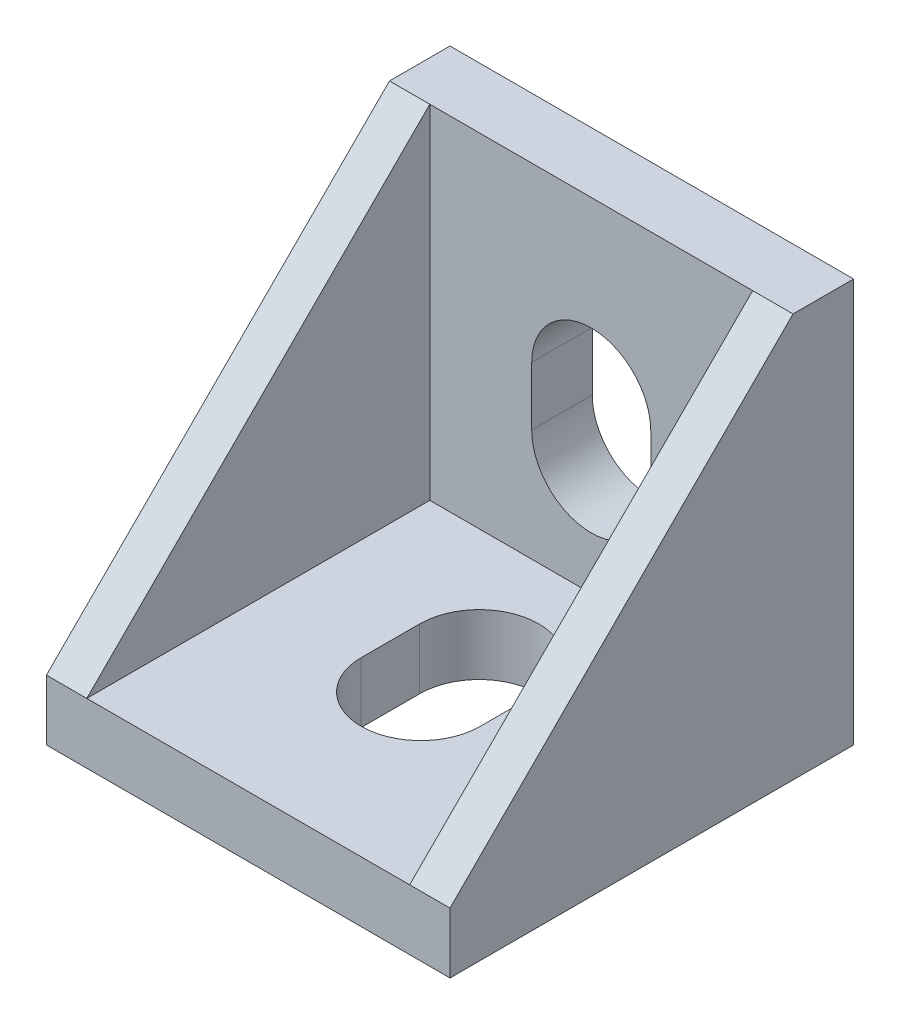
ISO-10303-21;
HEADER;
FILE_DESCRIPTION(('STEP AP214'),'2;1');
FILE_NAME('part.step','',(''),(''),'','','');
FILE_SCHEMA(('AUTOMOTIVE_DESIGN { 1 0 10303 214 1 1 1 1 }'));
ENDSEC;
DATA;
#1=APPLICATION_CONTEXT('core data for automotive mechanical design processes');
#2=APPLICATION_PROTOCOL_DEFINITION('international standard','automotive_design',2000,#1);
#3=PRODUCT_CONTEXT('',#1,'mechanical');
#4=PRODUCT('Part','Part','',(#3));
#5=PRODUCT_RELATED_PRODUCT_CATEGORY('part','',(#4));
#6=PRODUCT_DEFINITION_FORMATION('','',#4);
#7=PRODUCT_DEFINITION_CONTEXT('part definition',#1,'design');
#8=PRODUCT_DEFINITION('design','',#6,#7);
#9=PRODUCT_DEFINITION_SHAPE('','',#8);
#10=(LENGTH_UNIT() NAMED_UNIT(*) SI_UNIT(.MILLI.,.METRE.));
#11=(NAMED_UNIT(*) PLANE_ANGLE_UNIT() SI_UNIT($,.RADIAN.));
#12=(NAMED_UNIT(*) SI_UNIT($,.STERADIAN.) SOLID_ANGLE_UNIT());
#13=UNCERTAINTY_MEASURE_WITH_UNIT(LENGTH_MEASURE(1.E-05),#10,'distance_accuracy_value','');
#14=(GEOMETRIC_REPRESENTATION_CONTEXT(3) GLOBAL_UNCERTAINTY_ASSIGNED_CONTEXT((#13)) GLOBAL_UNIT_ASSIGNED_CONTEXT((#10,
#11,#12)) REPRESENTATION_CONTEXT('',''));
#15=CARTESIAN_POINT('',(0.,0.,0.));
#16=DIRECTION('',(0.,0.,1.));
#17=DIRECTION('',(1.,0.,0.));
#18=AXIS2_PLACEMENT_3D('',#15,#16,#17);
#19=CARTESIAN_POINT('',(0.,3.,0.));
#20=DIRECTION('',(0.,-1.,0.));
#21=DIRECTION('',(0.,0.,-1.));
#22=AXIS2_PLACEMENT_3D('',#19,#20,#21);
#23=PLANE('',#22);
#24=CARTESIAN_POINT('',(0.,3.,-1.45));
#25=DIRECTION('',(0.,1.,0.));
#26=DIRECTION('',(0.,0.,1.));
#27=AXIS2_PLACEMENT_3D('',#24,#25,#26);
#28=CIRCLE('',#27,2.95);
#29=CARTESIAN_POINT('',(2.95,3.,-1.45));
#30=VERTEX_POINT('',#29);
#31=CARTESIAN_POINT('',(-2.95,3.,-1.45));
#32=VERTEX_POINT('',#31);
#33=EDGE_CURVE('E182',#30,#32,#28,.T.);
#34=ORIENTED_EDGE('',*,*,#33,.F.);
#35=DIRECTION('',(0.,0.,-1.));
#36=VECTOR('',#35,1.);
#37=CARTESIAN_POINT('',(2.95,3.,1.45));
#38=LINE('',#37,#36);
#39=CARTESIAN_POINT('',(2.95,3.,1.45));
#40=VERTEX_POINT('',#39);
#41=EDGE_CURVE('E189',#40,#30,#38,.T.);
#42=ORIENTED_EDGE('',*,*,#41,.F.);
#43=CARTESIAN_POINT('',(0.,3.,1.45));
#44=DIRECTION('',(0.,1.,0.));
#45=DIRECTION('',(0.,0.,-1.));
#46=AXIS2_PLACEMENT_3D('',#43,#44,#45);
#47=CIRCLE('',#46,2.95);
#48=CARTESIAN_POINT('',(-2.95,3.,1.45));
#49=VERTEX_POINT('',#48);
#50=EDGE_CURVE('E187',#49,#40,#47,.T.);
#51=ORIENTED_EDGE('',*,*,#50,.F.);
#52=DIRECTION('',(0.,0.,1.));
#53=VECTOR('',#52,1.);
#54=CARTESIAN_POINT('',(-2.95,3.,1.45));
#55=LINE('',#54,#53);
#56=EDGE_CURVE('E184',#32,#49,#55,.T.);
#57=ORIENTED_EDGE('',*,*,#56,.F.);
#58=EDGE_LOOP('',(#34,#42,#51,#57));
#59=FACE_BOUND('',#58,.T.);
#60=DIRECTION('',(0.,0.,1.));
#61=VECTOR('',#60,1.);
#62=CARTESIAN_POINT('',(-8.,3.,-7.));
#63=LINE('',#62,#61);
#64=CARTESIAN_POINT('',(-8.,3.,-7.));
#65=VERTEX_POINT('',#64);
#66=CARTESIAN_POINT('',(-8.,3.,10.));
#67=VERTEX_POINT('',#66);
#68=EDGE_CURVE('E150',#65,#67,#63,.T.);
#69=ORIENTED_EDGE('',*,*,#68,.T.);
#70=DIRECTION('',(1.,0.,0.));
#71=VECTOR('',#70,1.);
#72=CARTESIAN_POINT('',(-10.,3.,10.));
#73=LINE('',#72,#71);
#74=CARTESIAN_POINT('',(8.,3.,10.));
#75=VERTEX_POINT('',#74);
#76=EDGE_CURVE('E211',#67,#75,#73,.T.);
#77=ORIENTED_EDGE('',*,*,#76,.T.);
#78=DIRECTION('',(0.,0.,-1.));
#79=VECTOR('',#78,1.);
#80=CARTESIAN_POINT('',(8.,3.,-7.));
#81=LINE('',#80,#79);
#82=CARTESIAN_POINT('',(8.,3.,-7.));
#83=VERTEX_POINT('',#82);
#84=EDGE_CURVE('E170',#75,#83,#81,.T.);
#85=ORIENTED_EDGE('',*,*,#84,.T.);
#86=DIRECTION('',(-1.,0.,0.));
#87=VECTOR('',#86,1.);
#88=CARTESIAN_POINT('',(0.,3.,-7.));
#89=LINE('',#88,#87);
#90=EDGE_CURVE('E164',#83,#65,#89,.T.);
#91=ORIENTED_EDGE('',*,*,#90,.T.);
#92=EDGE_LOOP('',(#69,#77,#85,#91));
#93=FACE_BOUND('',#92,.T.);
#94=ADVANCED_FACE('F38',(#59,#93),#23,.F.);
#95=CARTESIAN_POINT('',(0.,0.,-7.));
#96=DIRECTION('',(0.,0.,1.));
#97=DIRECTION('',(1.,0.,0.));
#98=AXIS2_PLACEMENT_3D('',#95,#96,#97);
#99=PLANE('',#98);
#100=CARTESIAN_POINT('',(0.,11.45,-7.));
#101=DIRECTION('',(0.,0.,-1.));
#102=DIRECTION('',(-1.,0.,0.));
#103=AXIS2_PLACEMENT_3D('',#100,#101,#102);
#104=CIRCLE('',#103,2.95);
#105=CARTESIAN_POINT('',(-2.95,11.45,-7.));
#106=VERTEX_POINT('',#105);
#107=CARTESIAN_POINT('',(2.95,11.45,-7.));
#108=VERTEX_POINT('',#107);
#109=EDGE_CURVE('E263',#106,#108,#104,.T.);
#110=ORIENTED_EDGE('',*,*,#109,.T.);
#111=DIRECTION('',(0.,-1.,0.));
#112=VECTOR('',#111,1.);
#113=CARTESIAN_POINT('',(2.95,8.55,-7.));
#114=LINE('',#113,#112);
#115=CARTESIAN_POINT('',(2.95,8.55,-7.));
#116=VERTEX_POINT('',#115);
#117=EDGE_CURVE('E266',#108,#116,#114,.T.);
#118=ORIENTED_EDGE('',*,*,#117,.T.);
#119=CARTESIAN_POINT('',(0.,8.55,-7.));
#120=DIRECTION('',(0.,0.,-1.));
#121=DIRECTION('',(1.,0.,0.));
#122=AXIS2_PLACEMENT_3D('',#119,#120,#121);
#123=CIRCLE('',#122,2.95);
#124=CARTESIAN_POINT('',(-2.95,8.55,-7.));
#125=VERTEX_POINT('',#124);
#126=EDGE_CURVE('E270',#116,#125,#123,.T.);
#127=ORIENTED_EDGE('',*,*,#126,.T.);
#128=DIRECTION('',(0.,1.,0.));
#129=VECTOR('',#128,1.);
#130=CARTESIAN_POINT('',(-2.95,8.55,-7.));
#131=LINE('',#130,#129);
#132=EDGE_CURVE('E273',#125,#106,#131,.T.);
#133=ORIENTED_EDGE('',*,*,#132,.T.);
#134=EDGE_LOOP('',(#110,#118,#127,#133));
#135=FACE_BOUND('',#134,.T.);
#136=DIRECTION('',(1.,0.,0.));
#137=VECTOR('',#136,1.);
#138=CARTESIAN_POINT('',(10.,20.,-7.));
#139=LINE('',#138,#137);
#140=CARTESIAN_POINT('',(-8.,20.,-7.));
#141=VERTEX_POINT('',#140);
#142=CARTESIAN_POINT('',(8.,20.,-7.));
#143=VERTEX_POINT('',#142);
#144=EDGE_CURVE('E165',#141,#143,#139,.T.);
#145=ORIENTED_EDGE('',*,*,#144,.F.);
#146=DIRECTION('',(0.,-1.,0.));
#147=VECTOR('',#146,1.);
#148=CARTESIAN_POINT('',(-8.,20.,-7.));
#149=LINE('',#148,#147);
#150=EDGE_CURVE('E153',#141,#65,#149,.T.);
#151=ORIENTED_EDGE('',*,*,#150,.T.);
#152=ORIENTED_EDGE('',*,*,#90,.F.);
#153=DIRECTION('',(0.,1.,0.));
#154=VECTOR('',#153,1.);
#155=CARTESIAN_POINT('',(8.,20.,-7.));
#156=LINE('',#155,#154);
#157=EDGE_CURVE('E251',#83,#143,#156,.T.);
#158=ORIENTED_EDGE('',*,*,#157,.T.);
#159=EDGE_LOOP('',(#145,#151,#152,#158));
#160=FACE_BOUND('',#159,.T.);
#161=ADVANCED_FACE('F162',(#135,#160),#99,.T.);
#162=CARTESIAN_POINT('',(0.,0.,0.));
#163=DIRECTION('',(0.,-1.,0.));
#164=DIRECTION('',(0.,0.,-1.));
#165=AXIS2_PLACEMENT_3D('',#162,#163,#164);
#166=PLANE('',#165);
#167=DIRECTION('',(1.,0.,0.));
#168=VECTOR('',#167,1.);
#169=CARTESIAN_POINT('',(-10.,0.,10.));
#170=LINE('',#169,#168);
#171=CARTESIAN_POINT('',(-10.,0.,10.));
#172=VERTEX_POINT('',#171);
#173=CARTESIAN_POINT('',(10.,0.,10.));
#174=VERTEX_POINT('',#173);
#175=EDGE_CURVE('E217',#172,#174,#170,.T.);
#176=ORIENTED_EDGE('',*,*,#175,.F.);
#177=DIRECTION('',(0.,0.,1.));
#178=VECTOR('',#177,1.);
#179=CARTESIAN_POINT('',(-10.,0.,10.));
#180=LINE('',#179,#178);
#181=CARTESIAN_POINT('',(-10.,0.,-10.));
#182=VERTEX_POINT('',#181);
#183=EDGE_CURVE('E215',#182,#172,#180,.T.);
#184=ORIENTED_EDGE('',*,*,#183,.F.);
#185=DIRECTION('',(-1.,0.,0.));
#186=VECTOR('',#185,1.);
#187=CARTESIAN_POINT('',(-10.,0.,-10.));
#188=LINE('',#187,#186);
#189=CARTESIAN_POINT('',(10.,0.,-10.));
#190=VERTEX_POINT('',#189);
#191=EDGE_CURVE('E213',#190,#182,#188,.T.);
#192=ORIENTED_EDGE('',*,*,#191,.F.);
#193=DIRECTION('',(0.,0.,-1.));
#194=VECTOR('',#193,1.);
#195=CARTESIAN_POINT('',(10.,0.,10.));
#196=LINE('',#195,#194);
#197=EDGE_CURVE('E207',#174,#190,#196,.T.);
#198=ORIENTED_EDGE('',*,*,#197,.F.);
#199=EDGE_LOOP('',(#176,#184,#192,#198));
#200=FACE_BOUND('',#199,.T.);
#201=DIRECTION('',(0.,0.,-1.));
#202=VECTOR('',#201,1.);
#203=CARTESIAN_POINT('',(2.95,0.,1.45));
#204=LINE('',#203,#202);
#205=CARTESIAN_POINT('',(2.95,0.,1.45));
#206=VERTEX_POINT('',#205);
#207=CARTESIAN_POINT('',(2.95,0.,-1.45));
#208=VERTEX_POINT('',#207);
#209=EDGE_CURVE('E185',#206,#208,#204,.T.);
#210=ORIENTED_EDGE('',*,*,#209,.T.);
#211=CARTESIAN_POINT('',(0.,0.,-1.45));
#212=DIRECTION('',(0.,1.,0.));
#213=DIRECTION('',(0.,0.,1.));
#214=AXIS2_PLACEMENT_3D('',#211,#212,#213);
#215=CIRCLE('',#214,2.95);
#216=CARTESIAN_POINT('',(-2.95,0.,-1.45));
#217=VERTEX_POINT('',#216);
#218=EDGE_CURVE('E171',#208,#217,#215,.T.);
#219=ORIENTED_EDGE('',*,*,#218,.T.);
#220=DIRECTION('',(0.,0.,1.));
#221=VECTOR('',#220,1.);
#222=CARTESIAN_POINT('',(-2.95,0.,1.45));
#223=LINE('',#222,#221);
#224=CARTESIAN_POINT('',(-2.95,0.,1.45));
#225=VERTEX_POINT('',#224);
#226=EDGE_CURVE('E175',#217,#225,#223,.T.);
#227=ORIENTED_EDGE('',*,*,#226,.T.);
#228=CARTESIAN_POINT('',(0.,0.,1.45));
#229=DIRECTION('',(0.,1.,0.));
#230=DIRECTION('',(0.,0.,-1.));
#231=AXIS2_PLACEMENT_3D('',#228,#229,#230);
#232=CIRCLE('',#231,2.95);
#233=EDGE_CURVE('E194',#225,#206,#232,.T.);
#234=ORIENTED_EDGE('',*,*,#233,.T.);
#235=EDGE_LOOP('',(#210,#219,#227,#234));
#236=FACE_BOUND('',#235,.T.);
#237=ADVANCED_FACE('F237',(#200,#236),#166,.T.);
#238=CARTESIAN_POINT('',(10.,3.,10.));
#239=DIRECTION('',(-1.,0.,0.));
#240=DIRECTION('',(0.,0.,1.));
#241=AXIS2_PLACEMENT_3D('',#238,#239,#240);
#242=PLANE('',#241);
#243=ORIENTED_EDGE('',*,*,#197,.T.);
#244=DIRECTION('',(0.,-1.,0.));
#245=VECTOR('',#244,1.);
#246=CARTESIAN_POINT('',(10.,3.,-10.));
#247=LINE('',#246,#245);
#248=CARTESIAN_POINT('',(10.,20.,-10.));
#249=VERTEX_POINT('',#248);
#250=EDGE_CURVE('E11',#249,#190,#247,.T.);
#251=ORIENTED_EDGE('',*,*,#250,.F.);
#252=DIRECTION('',(0.,0.,-1.));
#253=VECTOR('',#252,1.);
#254=CARTESIAN_POINT('',(10.,20.,-7.));
#255=LINE('',#254,#253);
#256=CARTESIAN_POINT('',(10.,20.,-7.));
#257=VERTEX_POINT('',#256);
#258=EDGE_CURVE('E172',#257,#249,#255,.T.);
#259=ORIENTED_EDGE('',*,*,#258,.F.);
#260=DIRECTION('',(0.,-0.707106781186547,0.707106781186547));
#261=VECTOR('',#260,1.);
#262=CARTESIAN_POINT('',(10.,20.,-7.));
#263=LINE('',#262,#261);
#264=CARTESIAN_POINT('',(10.,3.,10.));
#265=VERTEX_POINT('',#264);
#266=EDGE_CURVE('E158',#257,#265,#263,.T.);
#267=ORIENTED_EDGE('',*,*,#266,.T.);
#268=DIRECTION('',(0.,-1.,0.));
#269=VECTOR('',#268,1.);
#270=CARTESIAN_POINT('',(10.,3.,10.));
#271=LINE('',#270,#269);
#272=EDGE_CURVE('E210',#265,#174,#271,.T.);
#273=ORIENTED_EDGE('',*,*,#272,.T.);
#274=EDGE_LOOP('',(#243,#251,#259,#267,#273));
#275=FACE_BOUND('',#274,.T.);
#276=ADVANCED_FACE('F40',(#275),#242,.F.);
#277=CARTESIAN_POINT('',(-10.,3.,-10.));
#278=DIRECTION('',(0.,0.,1.));
#279=DIRECTION('',(1.,0.,0.));
#280=AXIS2_PLACEMENT_3D('',#277,#278,#279);
#281=PLANE('',#280);
#282=ORIENTED_EDGE('',*,*,#191,.T.);
#283=DIRECTION('',(0.,-1.,0.));
#284=VECTOR('',#283,1.);
#285=CARTESIAN_POINT('',(-10.,3.,-10.));
#286=LINE('',#285,#284);
#287=CARTESIAN_POINT('',(-10.,20.,-10.));
#288=VERTEX_POINT('',#287);
#289=EDGE_CURVE('E46',#288,#182,#286,.T.);
#290=ORIENTED_EDGE('',*,*,#289,.F.);
#291=DIRECTION('',(1.,0.,0.));
#292=VECTOR('',#291,1.);
#293=CARTESIAN_POINT('',(10.,20.,-10.));
#294=LINE('',#293,#292);
#295=EDGE_CURVE('E288',#288,#249,#294,.T.);
#296=ORIENTED_EDGE('',*,*,#295,.T.);
#297=ORIENTED_EDGE('',*,*,#250,.T.);
#298=EDGE_LOOP('',(#282,#290,#296,#297));
#299=FACE_BOUND('',#298,.T.);
#300=DIRECTION('',(0.,-1.,0.));
#301=VECTOR('',#300,1.);
#302=CARTESIAN_POINT('',(2.95,8.55,-10.));
#303=LINE('',#302,#301);
#304=CARTESIAN_POINT('',(2.95,11.45,-10.));
#305=VERTEX_POINT('',#304);
#306=CARTESIAN_POINT('',(2.95,8.55,-10.));
#307=VERTEX_POINT('',#306);
#308=EDGE_CURVE('E278',#305,#307,#303,.T.);
#309=ORIENTED_EDGE('',*,*,#308,.F.);
#310=CARTESIAN_POINT('',(0.,11.45,-10.));
#311=DIRECTION('',(0.,0.,-1.));
#312=DIRECTION('',(-1.,0.,0.));
#313=AXIS2_PLACEMENT_3D('',#310,#311,#312);
#314=CIRCLE('',#313,2.95);
#315=CARTESIAN_POINT('',(-2.95,11.45,-10.));
#316=VERTEX_POINT('',#315);
#317=EDGE_CURVE('E260',#316,#305,#314,.T.);
#318=ORIENTED_EDGE('',*,*,#317,.F.);
#319=DIRECTION('',(0.,1.,0.));
#320=VECTOR('',#319,1.);
#321=CARTESIAN_POINT('',(-2.95,8.55,-10.));
#322=LINE('',#321,#320);
#323=CARTESIAN_POINT('',(-2.95,8.55,-10.));
#324=VERTEX_POINT('',#323);
#325=EDGE_CURVE('E267',#324,#316,#322,.T.);
#326=ORIENTED_EDGE('',*,*,#325,.F.);
#327=CARTESIAN_POINT('',(0.,8.55,-10.));
#328=DIRECTION('',(0.,0.,-1.));
#329=DIRECTION('',(1.,0.,0.));
#330=AXIS2_PLACEMENT_3D('',#327,#328,#329);
#331=CIRCLE('',#330,2.95);
#332=EDGE_CURVE('E281',#307,#324,#331,.T.);
#333=ORIENTED_EDGE('',*,*,#332,.F.);
#334=EDGE_LOOP('',(#309,#318,#326,#333));
#335=FACE_BOUND('',#334,.T.);
#336=ADVANCED_FACE('F334',(#299,#335),#281,.F.);
#337=CARTESIAN_POINT('',(-10.,3.,10.));
#338=DIRECTION('',(1.,0.,0.));
#339=DIRECTION('',(0.,0.,-1.));
#340=AXIS2_PLACEMENT_3D('',#337,#338,#339);
#341=PLANE('',#340);
#342=DIRECTION('',(0.,-1.,0.));
#343=VECTOR('',#342,1.);
#344=CARTESIAN_POINT('',(-10.,3.,10.));
#345=LINE('',#344,#343);
#346=CARTESIAN_POINT('',(-10.,3.,10.));
#347=VERTEX_POINT('',#346);
#348=EDGE_CURVE('E221',#347,#172,#345,.T.);
#349=ORIENTED_EDGE('',*,*,#348,.F.);
#350=DIRECTION('',(0.,0.707106781186547,-0.707106781186547));
#351=VECTOR('',#350,1.);
#352=CARTESIAN_POINT('',(-10.,3.,10.));
#353=LINE('',#352,#351);
#354=CARTESIAN_POINT('',(-10.,20.,-7.));
#355=VERTEX_POINT('',#354);
#356=EDGE_CURVE('E305',#347,#355,#353,.T.);
#357=ORIENTED_EDGE('',*,*,#356,.T.);
#358=DIRECTION('',(0.,0.,-1.));
#359=VECTOR('',#358,1.);
#360=CARTESIAN_POINT('',(-10.,20.,-7.));
#361=LINE('',#360,#359);
#362=EDGE_CURVE('E178',#355,#288,#361,.T.);
#363=ORIENTED_EDGE('',*,*,#362,.T.);
#364=ORIENTED_EDGE('',*,*,#289,.T.);
#365=ORIENTED_EDGE('',*,*,#183,.T.);
#366=EDGE_LOOP('',(#349,#357,#363,#364,#365));
#367=FACE_BOUND('',#366,.T.);
#368=ADVANCED_FACE('F228',(#367),#341,.F.);
#369=CARTESIAN_POINT('',(-10.,3.,10.));
#370=DIRECTION('',(0.,0.,-1.));
#371=DIRECTION('',(-1.,0.,0.));
#372=AXIS2_PLACEMENT_3D('',#369,#370,#371);
#373=PLANE('',#372);
#374=ORIENTED_EDGE('',*,*,#175,.T.);
#375=ORIENTED_EDGE('',*,*,#272,.F.);
#376=DIRECTION('',(1.,0.,0.));
#377=VECTOR('',#376,1.);
#378=CARTESIAN_POINT('',(8.,3.,10.));
#379=LINE('',#378,#377);
#380=EDGE_CURVE('E258',#75,#265,#379,.T.);
#381=ORIENTED_EDGE('',*,*,#380,.F.);
#382=ORIENTED_EDGE('',*,*,#76,.F.);
#383=EDGE_CURVE('E208',#347,#67,#73,.T.);
#384=ORIENTED_EDGE('',*,*,#383,.F.);
#385=ORIENTED_EDGE('',*,*,#348,.T.);
#386=EDGE_LOOP('',(#374,#375,#381,#382,#384,#385));
#387=FACE_BOUND('',#386,.T.);
#388=ADVANCED_FACE('F242',(#387),#373,.F.);
#389=CARTESIAN_POINT('',(0.,3.,-1.45));
#390=DIRECTION('',(0.,-1.,0.));
#391=DIRECTION('',(0.,0.,-1.));
#392=AXIS2_PLACEMENT_3D('',#389,#390,#391);
#393=CYLINDRICAL_SURFACE('',#392,2.95);
#394=ORIENTED_EDGE('',*,*,#218,.F.);
#395=DIRECTION('',(0.,-1.,0.));
#396=VECTOR('',#395,1.);
#397=CARTESIAN_POINT('',(2.95,3.,-1.45));
#398=LINE('',#397,#396);
#399=EDGE_CURVE('E190',#30,#208,#398,.T.);
#400=ORIENTED_EDGE('',*,*,#399,.F.);
#401=ORIENTED_EDGE('',*,*,#33,.T.);
#402=DIRECTION('',(0.,-1.,0.));
#403=VECTOR('',#402,1.);
#404=CARTESIAN_POINT('',(-2.95,3.,-1.45));
#405=LINE('',#404,#403);
#406=EDGE_CURVE('E204',#32,#217,#405,.T.);
#407=ORIENTED_EDGE('',*,*,#406,.T.);
#408=EDGE_LOOP('',(#394,#400,#401,#407));
#409=FACE_BOUND('',#408,.T.);
#410=ADVANCED_FACE('F327',(#409),#393,.F.);
#411=CARTESIAN_POINT('',(-2.95,3.,1.45));
#412=DIRECTION('',(1.,0.,0.));
#413=DIRECTION('',(0.,0.,-1.));
#414=AXIS2_PLACEMENT_3D('',#411,#412,#413);
#415=PLANE('',#414);
#416=ORIENTED_EDGE('',*,*,#226,.F.);
#417=ORIENTED_EDGE('',*,*,#406,.F.);
#418=ORIENTED_EDGE('',*,*,#56,.T.);
#419=DIRECTION('',(0.,-1.,0.));
#420=VECTOR('',#419,1.);
#421=CARTESIAN_POINT('',(-2.95,3.,1.45));
#422=LINE('',#421,#420);
#423=EDGE_CURVE('E202',#49,#225,#422,.T.);
#424=ORIENTED_EDGE('',*,*,#423,.T.);
#425=EDGE_LOOP('',(#416,#417,#418,#424));
#426=FACE_BOUND('',#425,.T.);
#427=ADVANCED_FACE('F375',(#426),#415,.T.);
#428=CARTESIAN_POINT('',(0.,3.,1.45));
#429=DIRECTION('',(0.,-1.,0.));
#430=DIRECTION('',(0.,0.,-1.));
#431=AXIS2_PLACEMENT_3D('',#428,#429,#430);
#432=CYLINDRICAL_SURFACE('',#431,2.95);
#433=ORIENTED_EDGE('',*,*,#233,.F.);
#434=ORIENTED_EDGE('',*,*,#423,.F.);
#435=ORIENTED_EDGE('',*,*,#50,.T.);
#436=DIRECTION('',(0.,-1.,0.));
#437=VECTOR('',#436,1.);
#438=CARTESIAN_POINT('',(2.95,3.,1.45));
#439=LINE('',#438,#437);
#440=EDGE_CURVE('E61',#40,#206,#439,.T.);
#441=ORIENTED_EDGE('',*,*,#440,.T.);
#442=EDGE_LOOP('',(#433,#434,#435,#441));
#443=FACE_BOUND('',#442,.T.);
#444=ADVANCED_FACE('F373',(#443),#432,.F.);
#445=CARTESIAN_POINT('',(2.95,3.,1.45));
#446=DIRECTION('',(-1.,0.,0.));
#447=DIRECTION('',(0.,0.,1.));
#448=AXIS2_PLACEMENT_3D('',#445,#446,#447);
#449=PLANE('',#448);
#450=ORIENTED_EDGE('',*,*,#209,.F.);
#451=ORIENTED_EDGE('',*,*,#440,.F.);
#452=ORIENTED_EDGE('',*,*,#41,.T.);
#453=ORIENTED_EDGE('',*,*,#399,.T.);
#454=EDGE_LOOP('',(#450,#451,#452,#453));
#455=FACE_BOUND('',#454,.T.);
#456=ADVANCED_FACE('F370',(#455),#449,.T.);
#457=CARTESIAN_POINT('',(10.,20.,-7.));
#458=DIRECTION('',(0.,1.,0.));
#459=DIRECTION('',(0.,0.,1.));
#460=AXIS2_PLACEMENT_3D('',#457,#458,#459);
#461=PLANE('',#460);
#462=ORIENTED_EDGE('',*,*,#295,.F.);
#463=ORIENTED_EDGE('',*,*,#362,.F.);
#464=EDGE_CURVE('E295',#355,#141,#139,.T.);
#465=ORIENTED_EDGE('',*,*,#464,.T.);
#466=ORIENTED_EDGE('',*,*,#144,.T.);
#467=DIRECTION('',(1.,0.,0.));
#468=VECTOR('',#467,1.);
#469=CARTESIAN_POINT('',(8.,20.,-7.));
#470=LINE('',#469,#468);
#471=EDGE_CURVE('E261',#143,#257,#470,.T.);
#472=ORIENTED_EDGE('',*,*,#471,.T.);
#473=ORIENTED_EDGE('',*,*,#258,.T.);
#474=EDGE_LOOP('',(#462,#463,#465,#466,#472,#473));
#475=FACE_BOUND('',#474,.T.);
#476=ADVANCED_FACE('F298',(#475),#461,.T.);
#477=CARTESIAN_POINT('',(0.,11.45,-7.));
#478=DIRECTION('',(0.,0.,-1.));
#479=DIRECTION('',(-1.,0.,0.));
#480=AXIS2_PLACEMENT_3D('',#477,#478,#479);
#481=CYLINDRICAL_SURFACE('',#480,2.95);
#482=ORIENTED_EDGE('',*,*,#317,.T.);
#483=DIRECTION('',(0.,0.,-1.));
#484=VECTOR('',#483,1.);
#485=CARTESIAN_POINT('',(2.95,11.45,-7.));
#486=LINE('',#485,#484);
#487=EDGE_CURVE('E276',#108,#305,#486,.T.);
#488=ORIENTED_EDGE('',*,*,#487,.F.);
#489=ORIENTED_EDGE('',*,*,#109,.F.);
#490=DIRECTION('',(0.,0.,-1.));
#491=VECTOR('',#490,1.);
#492=CARTESIAN_POINT('',(-2.95,11.45,-7.));
#493=LINE('',#492,#491);
#494=EDGE_CURVE('E286',#106,#316,#493,.T.);
#495=ORIENTED_EDGE('',*,*,#494,.T.);
#496=EDGE_LOOP('',(#482,#488,#489,#495));
#497=FACE_BOUND('',#496,.T.);
#498=ADVANCED_FACE('F350',(#497),#481,.F.);
#499=CARTESIAN_POINT('',(-2.95,8.55,-7.));
#500=DIRECTION('',(-1.,0.,0.));
#501=DIRECTION('',(0.,0.,1.));
#502=AXIS2_PLACEMENT_3D('',#499,#500,#501);
#503=PLANE('',#502);
#504=ORIENTED_EDGE('',*,*,#325,.T.);
#505=ORIENTED_EDGE('',*,*,#494,.F.);
#506=ORIENTED_EDGE('',*,*,#132,.F.);
#507=DIRECTION('',(0.,0.,-1.));
#508=VECTOR('',#507,1.);
#509=CARTESIAN_POINT('',(-2.95,8.55,-7.));
#510=LINE('',#509,#508);
#511=EDGE_CURVE('E289',#125,#324,#510,.T.);
#512=ORIENTED_EDGE('',*,*,#511,.T.);
#513=EDGE_LOOP('',(#504,#505,#506,#512));
#514=FACE_BOUND('',#513,.T.);
#515=ADVANCED_FACE('F353',(#514),#503,.F.);
#516=CARTESIAN_POINT('',(0.,8.55,-7.));
#517=DIRECTION('',(0.,0.,-1.));
#518=DIRECTION('',(-1.,0.,0.));
#519=AXIS2_PLACEMENT_3D('',#516,#517,#518);
#520=CYLINDRICAL_SURFACE('',#519,2.95);
#521=ORIENTED_EDGE('',*,*,#332,.T.);
#522=ORIENTED_EDGE('',*,*,#511,.F.);
#523=ORIENTED_EDGE('',*,*,#126,.F.);
#524=DIRECTION('',(0.,0.,-1.));
#525=VECTOR('',#524,1.);
#526=CARTESIAN_POINT('',(2.95,8.55,-7.));
#527=LINE('',#526,#525);
#528=EDGE_CURVE('E291',#116,#307,#527,.T.);
#529=ORIENTED_EDGE('',*,*,#528,.T.);
#530=EDGE_LOOP('',(#521,#522,#523,#529));
#531=FACE_BOUND('',#530,.T.);
#532=ADVANCED_FACE('F355',(#531),#520,.F.);
#533=CARTESIAN_POINT('',(2.95,8.55,-7.));
#534=DIRECTION('',(1.,0.,0.));
#535=DIRECTION('',(0.,0.,-1.));
#536=AXIS2_PLACEMENT_3D('',#533,#534,#535);
#537=PLANE('',#536);
#538=ORIENTED_EDGE('',*,*,#308,.T.);
#539=ORIENTED_EDGE('',*,*,#528,.F.);
#540=ORIENTED_EDGE('',*,*,#117,.F.);
#541=ORIENTED_EDGE('',*,*,#487,.T.);
#542=EDGE_LOOP('',(#538,#539,#540,#541));
#543=FACE_BOUND('',#542,.T.);
#544=ADVANCED_FACE('F346',(#543),#537,.F.);
#545=CARTESIAN_POINT('',(8.,20.,-7.));
#546=DIRECTION('',(0.,0.707106781186547,0.707106781186547));
#547=DIRECTION('',(0.,-0.707106781186548,0.707106781186548));
#548=AXIS2_PLACEMENT_3D('',#545,#546,#547);
#549=PLANE('',#548);
#550=ORIENTED_EDGE('',*,*,#266,.F.);
#551=ORIENTED_EDGE('',*,*,#471,.F.);
#552=DIRECTION('',(0.,-0.707106781186547,0.707106781186547));
#553=VECTOR('',#552,1.);
#554=CARTESIAN_POINT('',(8.,20.,-7.));
#555=LINE('',#554,#553);
#556=EDGE_CURVE('E253',#143,#75,#555,.T.);
#557=ORIENTED_EDGE('',*,*,#556,.T.);
#558=ORIENTED_EDGE('',*,*,#380,.T.);
#559=EDGE_LOOP('',(#550,#551,#557,#558));
#560=FACE_BOUND('',#559,.T.);
#561=ADVANCED_FACE('F301',(#560),#549,.T.);
#562=CARTESIAN_POINT('',(8.,0.,0.));
#563=DIRECTION('',(-1.,0.,0.));
#564=DIRECTION('',(0.,0.,1.));
#565=AXIS2_PLACEMENT_3D('',#562,#563,#564);
#566=PLANE('',#565);
#567=ORIENTED_EDGE('',*,*,#157,.F.);
#568=ORIENTED_EDGE('',*,*,#84,.F.);
#569=ORIENTED_EDGE('',*,*,#556,.F.);
#570=EDGE_LOOP('',(#567,#568,#569));
#571=FACE_BOUND('',#570,.T.);
#572=ADVANCED_FACE('F303',(#571),#566,.T.);
#573=CARTESIAN_POINT('',(-8.,3.,10.));
#574=DIRECTION('',(0.,0.707106781186547,0.707106781186547));
#575=DIRECTION('',(0.,-0.707106781186548,0.707106781186548));
#576=AXIS2_PLACEMENT_3D('',#573,#574,#575);
#577=PLANE('',#576);
#578=ORIENTED_EDGE('',*,*,#356,.F.);
#579=ORIENTED_EDGE('',*,*,#383,.T.);
#580=DIRECTION('',(0.,0.707106781186547,-0.707106781186547));
#581=VECTOR('',#580,1.);
#582=CARTESIAN_POINT('',(-8.,3.,10.));
#583=LINE('',#582,#581);
#584=EDGE_CURVE('E53',#67,#141,#583,.T.);
#585=ORIENTED_EDGE('',*,*,#584,.T.);
#586=ORIENTED_EDGE('',*,*,#464,.F.);
#587=EDGE_LOOP('',(#578,#579,#585,#586));
#588=FACE_BOUND('',#587,.T.);
#589=ADVANCED_FACE('F307',(#588),#577,.T.);
#590=CARTESIAN_POINT('',(-8.,0.,0.));
#591=DIRECTION('',(-1.,0.,0.));
#592=DIRECTION('',(0.,0.,1.));
#593=AXIS2_PLACEMENT_3D('',#590,#591,#592);
#594=PLANE('',#593);
#595=ORIENTED_EDGE('',*,*,#584,.F.);
#596=ORIENTED_EDGE('',*,*,#68,.F.);
#597=ORIENTED_EDGE('',*,*,#150,.F.);
#598=EDGE_LOOP('',(#595,#596,#597));
#599=FACE_BOUND('',#598,.T.);
#600=ADVANCED_FACE('F152',(#599),#594,.F.);
#601=CLOSED_SHELL('',(#94,#161,#237,#276,#336,#368,#388,#410,#427,#444,#456,#476,#498,#515,#532,
#544,#561,#572,#589,#600));
#602=MANIFOLD_SOLID_BREP('B2',#601);
#603=ADVANCED_BREP_SHAPE_REPRESENTATION('',(#18,#602),#14);
#604=SHAPE_DEFINITION_REPRESENTATION(#9,#603);
ENDSEC;
END-ISO-10303-21;
